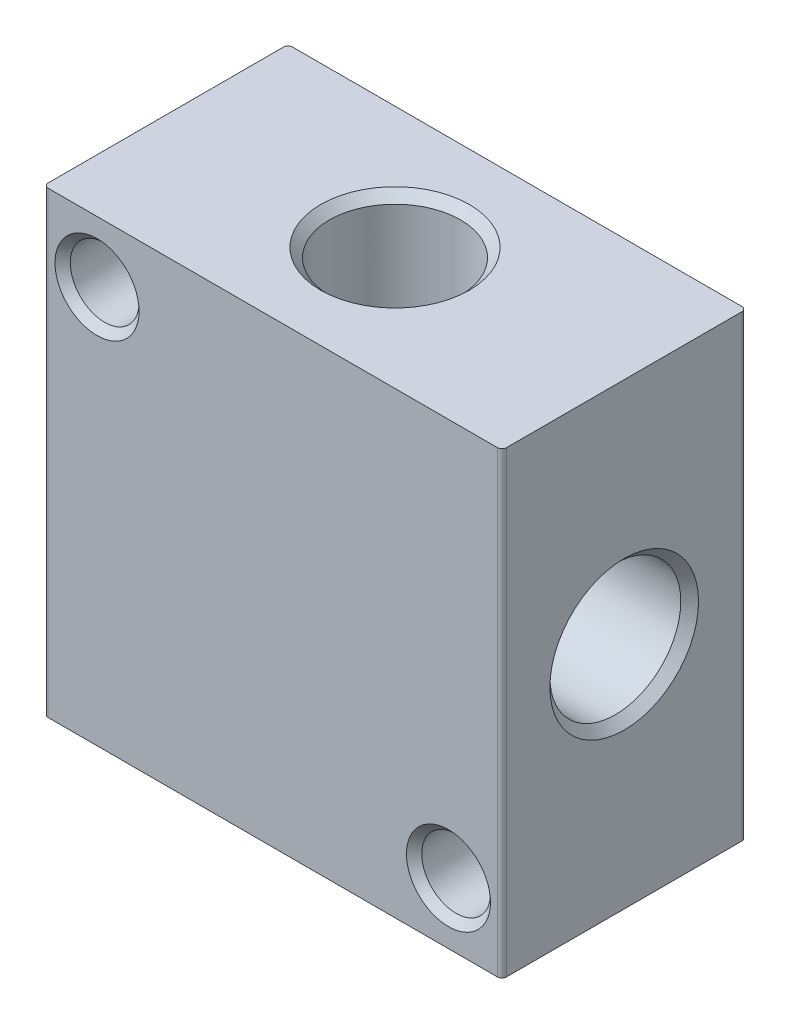
ISO-10303-21;
HEADER;
FILE_DESCRIPTION(('STEP AP214'),'2;1');
FILE_NAME('part.step','',(''),(''),'','','');
FILE_SCHEMA(('AUTOMOTIVE_DESIGN { 1 0 10303 214 1 1 1 1 }'));
ENDSEC;
DATA;
#1=APPLICATION_CONTEXT('core data for automotive mechanical design processes');
#2=APPLICATION_PROTOCOL_DEFINITION('international standard','automotive_design',2000,#1);
#3=PRODUCT_CONTEXT('',#1,'mechanical');
#4=PRODUCT('Part','Part','',(#3));
#5=PRODUCT_RELATED_PRODUCT_CATEGORY('part','',(#4));
#6=PRODUCT_DEFINITION_FORMATION('','',#4);
#7=PRODUCT_DEFINITION_CONTEXT('part definition',#1,'design');
#8=PRODUCT_DEFINITION('design','',#6,#7);
#9=PRODUCT_DEFINITION_SHAPE('','',#8);
#10=(LENGTH_UNIT() NAMED_UNIT(*) SI_UNIT(.MILLI.,.METRE.));
#11=(NAMED_UNIT(*) PLANE_ANGLE_UNIT() SI_UNIT($,.RADIAN.));
#12=(NAMED_UNIT(*) SI_UNIT($,.STERADIAN.) SOLID_ANGLE_UNIT());
#13=UNCERTAINTY_MEASURE_WITH_UNIT(LENGTH_MEASURE(1.E-05),#10,'distance_accuracy_value','');
#14=(GEOMETRIC_REPRESENTATION_CONTEXT(3) GLOBAL_UNCERTAINTY_ASSIGNED_CONTEXT((#13)) GLOBAL_UNIT_ASSIGNED_CONTEXT((#10,
#11,#12)) REPRESENTATION_CONTEXT('',''));
#15=CARTESIAN_POINT('',(0.,0.,0.));
#16=DIRECTION('',(0.,0.,1.));
#17=DIRECTION('',(1.,0.,0.));
#18=AXIS2_PLACEMENT_3D('',#15,#16,#17);
#19=CARTESIAN_POINT('',(-0.0865140894344868,0.,8.));
#20=DIRECTION('',(1.,0.,0.));
#21=DIRECTION('',(0.,0.,-1.));
#22=AXIS2_PLACEMENT_3D('',#19,#20,#21);
#23=CYLINDRICAL_SURFACE('',#22,4.283);
#24=CARTESIAN_POINT('',(14.4190149057486,0.,8.));
#25=DIRECTION('',(-1.,0.,0.));
#26=DIRECTION('',(0.,0.,-1.));
#27=AXIS2_PLACEMENT_3D('',#24,#25,#26);
#28=CIRCLE('',#27,4.28299999999923);
#29=CARTESIAN_POINT('',(14.4190149057486,0.,3.71700000000077));
#30=VERTEX_POINT('',#29);
#31=EDGE_CURVE('E95',#30,#30,#28,.T.);
#32=ORIENTED_EDGE('',*,*,#31,.F.);
#33=EDGE_LOOP('',(#32));
#34=FACE_BOUND('',#33,.T.);
#35=CARTESIAN_POINT('',(0.,0.,8.));
#36=DIRECTION('',(-0.707106781186547,-0.707106781186547,0.));
#37=DIRECTION('',(0.707106781186547,-0.707106781186547,0.));
#38=AXIS2_PLACEMENT_3D('',#35,#36,#37);
#39=ELLIPSE('',#38,6.05707668764397,4.283);
#40=CARTESIAN_POINT('',(0.,0.,12.283));
#41=VERTEX_POINT('',#40);
#42=CARTESIAN_POINT('',(0.,0.,3.717));
#43=VERTEX_POINT('',#42);
#44=EDGE_CURVE('E19',#41,#43,#39,.F.);
#45=ORIENTED_EDGE('',*,*,#44,.F.);
#46=CARTESIAN_POINT('',(0.,0.,8.));
#47=DIRECTION('',(0.707106781186547,-0.707106781186547,0.));
#48=DIRECTION('',(-0.707106781186547,-0.707106781186547,0.));
#49=AXIS2_PLACEMENT_3D('',#46,#47,#48);
#50=ELLIPSE('',#49,6.05707668764397,4.283);
#51=EDGE_CURVE('E84',#43,#41,#50,.T.);
#52=ORIENTED_EDGE('',*,*,#51,.F.);
#53=EDGE_LOOP('',(#45,#52));
#54=FACE_BOUND('',#53,.T.);
#55=ADVANCED_FACE('F16',(#34,#54),#23,.F.);
#56=CARTESIAN_POINT('',(-14.4190149057478,0.,8.));
#57=DIRECTION('',(1.,0.,0.));
#58=DIRECTION('',(0.,0.,-1.));
#59=AXIS2_PLACEMENT_3D('',#56,#57,#58);
#60=CYLINDRICAL_SURFACE('',#59,4.283);
#61=CARTESIAN_POINT('',(0.,0.,8.));
#62=DIRECTION('',(0.707106781186547,-0.707106781186547,0.));
#63=DIRECTION('',(-0.707106781186547,-0.707106781186547,0.));
#64=AXIS2_PLACEMENT_3D('',#61,#62,#63);
#65=ELLIPSE('',#64,6.05707668764397,4.283);
#66=EDGE_CURVE('E89',#43,#41,#65,.F.);
#67=ORIENTED_EDGE('',*,*,#66,.F.);
#68=CARTESIAN_POINT('',(0.,0.,8.));
#69=DIRECTION('',(-0.707106781186547,-0.707106781186547,0.));
#70=DIRECTION('',(0.707106781186547,-0.707106781186547,0.));
#71=AXIS2_PLACEMENT_3D('',#68,#69,#70);
#72=ELLIPSE('',#71,6.05707668764397,4.283);
#73=EDGE_CURVE('E99',#41,#43,#72,.T.);
#74=ORIENTED_EDGE('',*,*,#73,.F.);
#75=EDGE_LOOP('',(#67,#74));
#76=FACE_BOUND('',#75,.T.);
#77=CARTESIAN_POINT('',(-14.4190149057486,0.,8.));
#78=DIRECTION('',(1.,0.,0.));
#79=DIRECTION('',(0.,0.,-1.));
#80=AXIS2_PLACEMENT_3D('',#77,#78,#79);
#81=CIRCLE('',#80,4.28299999999924);
#82=CARTESIAN_POINT('',(-14.4190149057486,0.,3.71700000000076));
#83=VERTEX_POINT('',#82);
#84=EDGE_CURVE('E100',#83,#83,#81,.T.);
#85=ORIENTED_EDGE('',*,*,#84,.F.);
#86=EDGE_LOOP('',(#85));
#87=FACE_BOUND('',#86,.T.);
#88=ADVANCED_FACE('F102',(#76,#87),#60,.F.);
#89=CARTESIAN_POINT('',(0.,0.0865140894344868,8.));
#90=DIRECTION('',(0.,-1.,0.));
#91=DIRECTION('',(0.,0.,-1.));
#92=AXIS2_PLACEMENT_3D('',#89,#90,#91);
#93=CYLINDRICAL_SURFACE('',#92,4.283);
#94=ORIENTED_EDGE('',*,*,#66,.T.);
#95=ORIENTED_EDGE('',*,*,#44,.T.);
#96=EDGE_LOOP('',(#94,#95));
#97=FACE_BOUND('',#96,.T.);
#98=CARTESIAN_POINT('',(0.,-14.4190149057486,8.));
#99=DIRECTION('',(0.,1.,0.));
#100=DIRECTION('',(0.,0.,-1.));
#101=AXIS2_PLACEMENT_3D('',#98,#99,#100);
#102=CIRCLE('',#101,4.28299999999924);
#103=CARTESIAN_POINT('',(0.,-14.4190149057486,3.71700000000076));
#104=VERTEX_POINT('',#103);
#105=EDGE_CURVE('E114',#104,#104,#102,.T.);
#106=ORIENTED_EDGE('',*,*,#105,.F.);
#107=EDGE_LOOP('',(#106));
#108=FACE_BOUND('',#107,.T.);
#109=ADVANCED_FACE('F91',(#97,#108),#93,.F.);
#110=CARTESIAN_POINT('',(14.9999999999993,0.,8.));
#111=DIRECTION('',(1.,0.,0.));
#112=DIRECTION('',(0.,0.,-1.));
#113=AXIS2_PLACEMENT_3D('',#110,#111,#112);
#114=CONICAL_SURFACE('',#113,4.86398307230816,0.785396423296609);
#115=ORIENTED_EDGE('',*,*,#31,.T.);
#116=EDGE_LOOP('',(#115));
#117=FACE_BOUND('',#116,.T.);
#118=CARTESIAN_POINT('',(14.9999999999993,0.,8.));
#119=DIRECTION('',(1.,0.,0.));
#120=DIRECTION('',(0.,0.,-1.));
#121=AXIS2_PLACEMENT_3D('',#118,#119,#120);
#122=CIRCLE('',#121,4.86398307230816);
#123=CARTESIAN_POINT('',(14.9999999999993,0.,3.13601692769184));
#124=VERTEX_POINT('',#123);
#125=EDGE_CURVE('E115',#124,#124,#122,.F.);
#126=ORIENTED_EDGE('',*,*,#125,.F.);
#127=EDGE_LOOP('',(#126));
#128=FACE_BOUND('',#127,.T.);
#129=ADVANCED_FACE('F292',(#117,#128),#114,.F.);
#130=CARTESIAN_POINT('',(-14.9999999999993,0.,8.));
#131=DIRECTION('',(-1.,0.,0.));
#132=DIRECTION('',(0.,0.,1.));
#133=AXIS2_PLACEMENT_3D('',#130,#131,#132);
#134=CONICAL_SURFACE('',#133,4.86398307230816,0.785396423296609);
#135=CARTESIAN_POINT('',(-14.9999999999993,0.,8.));
#136=DIRECTION('',(-1.,0.,0.));
#137=DIRECTION('',(0.,0.,1.));
#138=AXIS2_PLACEMENT_3D('',#135,#136,#137);
#139=CIRCLE('',#138,4.86398307230816);
#140=CARTESIAN_POINT('',(-14.9999999999993,0.,12.8639830723082));
#141=VERTEX_POINT('',#140);
#142=EDGE_CURVE('E120',#141,#141,#139,.F.);
#143=ORIENTED_EDGE('',*,*,#142,.F.);
#144=EDGE_LOOP('',(#143));
#145=FACE_BOUND('',#144,.T.);
#146=ORIENTED_EDGE('',*,*,#84,.T.);
#147=EDGE_LOOP('',(#146));
#148=FACE_BOUND('',#147,.T.);
#149=ADVANCED_FACE('F286',(#145,#148),#134,.F.);
#150=CARTESIAN_POINT('',(0.,14.4190149057478,8.));
#151=DIRECTION('',(0.,-1.,0.));
#152=DIRECTION('',(0.,0.,-1.));
#153=AXIS2_PLACEMENT_3D('',#150,#151,#152);
#154=CYLINDRICAL_SURFACE('',#153,4.283);
#155=ORIENTED_EDGE('',*,*,#73,.T.);
#156=ORIENTED_EDGE('',*,*,#51,.T.);
#157=EDGE_LOOP('',(#155,#156));
#158=FACE_BOUND('',#157,.T.);
#159=CARTESIAN_POINT('',(0.,14.4190149057486,8.));
#160=DIRECTION('',(0.,-1.,0.));
#161=DIRECTION('',(0.,0.,-1.));
#162=AXIS2_PLACEMENT_3D('',#159,#160,#161);
#163=CIRCLE('',#162,4.28299999999924);
#164=CARTESIAN_POINT('',(0.,14.4190149057486,3.71700000000076));
#165=VERTEX_POINT('',#164);
#166=EDGE_CURVE('E123',#165,#165,#163,.T.);
#167=ORIENTED_EDGE('',*,*,#166,.F.);
#168=EDGE_LOOP('',(#167));
#169=FACE_BOUND('',#168,.T.);
#170=ADVANCED_FACE('F97',(#158,#169),#154,.F.);
#171=CARTESIAN_POINT('',(-14.7,15.,15.7));
#172=DIRECTION('',(0.,1.,0.));
#173=DIRECTION('',(-1.,0.,0.));
#174=AXIS2_PLACEMENT_3D('',#171,#172,#173);
#175=CYLINDRICAL_SURFACE('',#174,0.300000000000002);
#176=CARTESIAN_POINT('',(-14.7,15.,15.7));
#177=DIRECTION('',(0.,1.,0.));
#178=DIRECTION('',(-1.,0.,0.));
#179=AXIS2_PLACEMENT_3D('',#176,#177,#178);
#180=CIRCLE('',#179,0.300000000000002);
#181=CARTESIAN_POINT('',(-14.7,15.,16.));
#182=VERTEX_POINT('',#181);
#183=CARTESIAN_POINT('',(-15.,15.,15.7));
#184=VERTEX_POINT('',#183);
#185=EDGE_CURVE('E106',#182,#184,#180,.F.);
#186=ORIENTED_EDGE('',*,*,#185,.T.);
#187=DIRECTION('',(0.,1.,0.));
#188=VECTOR('',#187,1.);
#189=CARTESIAN_POINT('',(-15.,-15.,15.7));
#190=LINE('',#189,#188);
#191=CARTESIAN_POINT('',(-15.,-15.,15.7));
#192=VERTEX_POINT('',#191);
#193=EDGE_CURVE('E118',#192,#184,#190,.T.);
#194=ORIENTED_EDGE('',*,*,#193,.F.);
#195=CARTESIAN_POINT('',(-14.7000000000001,-15.,15.7));
#196=DIRECTION('',(0.,1.,0.));
#197=DIRECTION('',(-1.,0.,0.));
#198=AXIS2_PLACEMENT_3D('',#195,#196,#197);
#199=CIRCLE('',#198,0.300000000000002);
#200=CARTESIAN_POINT('',(-14.7,-15.,16.));
#201=VERTEX_POINT('',#200);
#202=EDGE_CURVE('E104',#192,#201,#199,.T.);
#203=ORIENTED_EDGE('',*,*,#202,.T.);
#204=DIRECTION('',(0.,1.,0.));
#205=VECTOR('',#204,1.);
#206=CARTESIAN_POINT('',(-14.7,-15.,16.));
#207=LINE('',#206,#205);
#208=EDGE_CURVE('E167',#182,#201,#207,.F.);
#209=ORIENTED_EDGE('',*,*,#208,.F.);
#210=EDGE_LOOP('',(#186,#194,#203,#209));
#211=FACE_BOUND('',#210,.T.);
#212=ADVANCED_FACE('F277',(#211),#175,.T.);
#213=CARTESIAN_POINT('',(14.7,-15.,15.7));
#214=DIRECTION('',(0.,-1.,0.));
#215=DIRECTION('',(1.,0.,0.));
#216=AXIS2_PLACEMENT_3D('',#213,#214,#215);
#217=CYLINDRICAL_SURFACE('',#216,0.300000000000002);
#218=CARTESIAN_POINT('',(14.7,-15.,15.7));
#219=DIRECTION('',(0.,-1.,0.));
#220=DIRECTION('',(1.,0.,0.));
#221=AXIS2_PLACEMENT_3D('',#218,#219,#220);
#222=CIRCLE('',#221,0.300000000000002);
#223=CARTESIAN_POINT('',(14.7,-15.,16.));
#224=VERTEX_POINT('',#223);
#225=CARTESIAN_POINT('',(15.,-15.,15.7));
#226=VERTEX_POINT('',#225);
#227=EDGE_CURVE('E112',#224,#226,#222,.F.);
#228=ORIENTED_EDGE('',*,*,#227,.T.);
#229=DIRECTION('',(0.,-1.,0.));
#230=VECTOR('',#229,1.);
#231=CARTESIAN_POINT('',(15.,0.,15.7));
#232=LINE('',#231,#230);
#233=CARTESIAN_POINT('',(15.,15.,15.7));
#234=VERTEX_POINT('',#233);
#235=EDGE_CURVE('E119',#234,#226,#232,.T.);
#236=ORIENTED_EDGE('',*,*,#235,.F.);
#237=CARTESIAN_POINT('',(14.7000000000001,15.,15.7));
#238=DIRECTION('',(0.,-1.,0.));
#239=DIRECTION('',(1.,0.,0.));
#240=AXIS2_PLACEMENT_3D('',#237,#238,#239);
#241=CIRCLE('',#240,0.300000000000002);
#242=CARTESIAN_POINT('',(14.7,15.,16.));
#243=VERTEX_POINT('',#242);
#244=EDGE_CURVE('E110',#234,#243,#241,.T.);
#245=ORIENTED_EDGE('',*,*,#244,.T.);
#246=DIRECTION('',(0.,1.,0.));
#247=VECTOR('',#246,1.);
#248=CARTESIAN_POINT('',(14.7,-15.,16.));
#249=LINE('',#248,#247);
#250=EDGE_CURVE('E128',#224,#243,#249,.T.);
#251=ORIENTED_EDGE('',*,*,#250,.F.);
#252=EDGE_LOOP('',(#228,#236,#245,#251));
#253=FACE_BOUND('',#252,.T.);
#254=ADVANCED_FACE('F270',(#253),#217,.T.);
#255=CARTESIAN_POINT('',(11.5,-11.,15.9999999999994));
#256=DIRECTION('',(0.,0.,1.));
#257=DIRECTION('',(1.,0.,0.));
#258=AXIS2_PLACEMENT_3D('',#255,#256,#257);
#259=CONICAL_SURFACE('',#258,2.74995878038691,0.785390668869455);
#260=CARTESIAN_POINT('',(11.5,-11.,15.9999999999994));
#261=DIRECTION('',(0.,0.,1.));
#262=DIRECTION('',(1.,0.,0.));
#263=AXIS2_PLACEMENT_3D('',#260,#261,#262);
#264=CIRCLE('',#263,2.74995878038691);
#265=CARTESIAN_POINT('',(14.2499587803869,-11.,15.9999999999994));
#266=VERTEX_POINT('',#265);
#267=EDGE_CURVE('E124',#266,#266,#264,.F.);
#268=ORIENTED_EDGE('',*,*,#267,.F.);
#269=EDGE_LOOP('',(#268));
#270=FACE_BOUND('',#269,.T.);
#271=CARTESIAN_POINT('',(11.5,-11.,15.5000337256449));
#272=DIRECTION('',(0.,0.,-1.));
#273=DIRECTION('',(1.,0.,0.));
#274=AXIS2_PLACEMENT_3D('',#271,#272,#273);
#275=CIRCLE('',#274,2.25);
#276=CARTESIAN_POINT('',(13.75,-11.,15.5000337256449));
#277=VERTEX_POINT('',#276);
#278=EDGE_CURVE('E170',#277,#277,#275,.F.);
#279=ORIENTED_EDGE('',*,*,#278,.F.);
#280=EDGE_LOOP('',(#279));
#281=FACE_BOUND('',#280,.T.);
#282=ADVANCED_FACE('F284',(#270,#281),#259,.F.);
#283=CARTESIAN_POINT('',(0.,-14.9999999999993,8.));
#284=DIRECTION('',(0.,-1.,0.));
#285=DIRECTION('',(0.,0.,-1.));
#286=AXIS2_PLACEMENT_3D('',#283,#284,#285);
#287=CONICAL_SURFACE('',#286,4.86398307230816,0.785396423296609);
#288=CARTESIAN_POINT('',(0.,-14.9999999999993,8.));
#289=DIRECTION('',(0.,-1.,0.));
#290=DIRECTION('',(0.,0.,-1.));
#291=AXIS2_PLACEMENT_3D('',#288,#289,#290);
#292=CIRCLE('',#291,4.86398307230816);
#293=CARTESIAN_POINT('',(0.,-14.9999999999993,3.13601692769184));
#294=VERTEX_POINT('',#293);
#295=EDGE_CURVE('E134',#294,#294,#292,.F.);
#296=ORIENTED_EDGE('',*,*,#295,.F.);
#297=EDGE_LOOP('',(#296));
#298=FACE_BOUND('',#297,.T.);
#299=ORIENTED_EDGE('',*,*,#105,.T.);
#300=EDGE_LOOP('',(#299));
#301=FACE_BOUND('',#300,.T.);
#302=ADVANCED_FACE('F310',(#298,#301),#287,.F.);
#303=CARTESIAN_POINT('',(15.,-15.,0.3));
#304=DIRECTION('',(1.,0.,0.));
#305=DIRECTION('',(0.,1.,0.));
#306=AXIS2_PLACEMENT_3D('',#303,#304,#305);
#307=PLANE('',#306);
#308=ORIENTED_EDGE('',*,*,#125,.T.);
#309=EDGE_LOOP('',(#308));
#310=FACE_BOUND('',#309,.T.);
#311=DIRECTION('',(0.,-1.,0.));
#312=VECTOR('',#311,1.);
#313=CARTESIAN_POINT('',(15.,0.,0.3));
#314=LINE('',#313,#312);
#315=CARTESIAN_POINT('',(15.,15.,0.3));
#316=VERTEX_POINT('',#315);
#317=CARTESIAN_POINT('',(15.,-15.,0.3));
#318=VERTEX_POINT('',#317);
#319=EDGE_CURVE('E127',#316,#318,#314,.T.);
#320=ORIENTED_EDGE('',*,*,#319,.F.);
#321=DIRECTION('',(0.,0.,-1.));
#322=VECTOR('',#321,1.);
#323=CARTESIAN_POINT('',(15.,15.,16.));
#324=LINE('',#323,#322);
#325=EDGE_CURVE('E145',#234,#316,#324,.T.);
#326=ORIENTED_EDGE('',*,*,#325,.F.);
#327=ORIENTED_EDGE('',*,*,#235,.T.);
#328=DIRECTION('',(0.,0.,1.));
#329=VECTOR('',#328,1.);
#330=CARTESIAN_POINT('',(15.,-15.,8.));
#331=LINE('',#330,#329);
#332=EDGE_CURVE('E132',#318,#226,#331,.T.);
#333=ORIENTED_EDGE('',*,*,#332,.F.);
#334=EDGE_LOOP('',(#320,#326,#327,#333));
#335=FACE_BOUND('',#334,.T.);
#336=ADVANCED_FACE('F267',(#310,#335),#307,.T.);
#337=CARTESIAN_POINT('',(-15.,-15.,0.3));
#338=DIRECTION('',(-1.,0.,0.));
#339=DIRECTION('',(0.,0.,1.));
#340=AXIS2_PLACEMENT_3D('',#337,#338,#339);
#341=PLANE('',#340);
#342=ORIENTED_EDGE('',*,*,#142,.T.);
#343=EDGE_LOOP('',(#342));
#344=FACE_BOUND('',#343,.T.);
#345=DIRECTION('',(0.,1.,0.));
#346=VECTOR('',#345,1.);
#347=CARTESIAN_POINT('',(-15.,0.,0.3));
#348=LINE('',#347,#346);
#349=CARTESIAN_POINT('',(-15.,-15.,0.3));
#350=VERTEX_POINT('',#349);
#351=CARTESIAN_POINT('',(-15.,15.,0.3));
#352=VERTEX_POINT('',#351);
#353=EDGE_CURVE('E141',#350,#352,#348,.T.);
#354=ORIENTED_EDGE('',*,*,#353,.F.);
#355=DIRECTION('',(0.,0.,-1.));
#356=VECTOR('',#355,1.);
#357=CARTESIAN_POINT('',(-15.,-15.,8.));
#358=LINE('',#357,#356);
#359=EDGE_CURVE('E133',#192,#350,#358,.T.);
#360=ORIENTED_EDGE('',*,*,#359,.F.);
#361=ORIENTED_EDGE('',*,*,#193,.T.);
#362=DIRECTION('',(0.,0.,-1.));
#363=VECTOR('',#362,1.);
#364=CARTESIAN_POINT('',(-15.,15.,16.));
#365=LINE('',#364,#363);
#366=EDGE_CURVE('E147',#352,#184,#365,.F.);
#367=ORIENTED_EDGE('',*,*,#366,.F.);
#368=EDGE_LOOP('',(#354,#360,#361,#367));
#369=FACE_BOUND('',#368,.T.);
#370=ADVANCED_FACE('F258',(#344,#369),#341,.T.);
#371=CARTESIAN_POINT('',(0.,14.9999999999993,8.));
#372=DIRECTION('',(0.,1.,0.));
#373=DIRECTION('',(0.,0.,1.));
#374=AXIS2_PLACEMENT_3D('',#371,#372,#373);
#375=CONICAL_SURFACE('',#374,4.86398307230816,0.785396423296609);
#376=ORIENTED_EDGE('',*,*,#166,.T.);
#377=EDGE_LOOP('',(#376));
#378=FACE_BOUND('',#377,.T.);
#379=CARTESIAN_POINT('',(0.,14.9999999999993,8.));
#380=DIRECTION('',(0.,1.,0.));
#381=DIRECTION('',(0.,0.,1.));
#382=AXIS2_PLACEMENT_3D('',#379,#380,#381);
#383=CIRCLE('',#382,4.86398307230816);
#384=CARTESIAN_POINT('',(0.,14.9999999999993,12.8639830723082));
#385=VERTEX_POINT('',#384);
#386=EDGE_CURVE('E148',#385,#385,#383,.F.);
#387=ORIENTED_EDGE('',*,*,#386,.F.);
#388=EDGE_LOOP('',(#387));
#389=FACE_BOUND('',#388,.T.);
#390=ADVANCED_FACE('F316',(#378,#389),#375,.F.);
#391=CARTESIAN_POINT('',(11.5,-11.,15.5000337256449));
#392=DIRECTION('',(0.,0.,-1.));
#393=DIRECTION('',(-1.,0.,0.));
#394=AXIS2_PLACEMENT_3D('',#391,#392,#393);
#395=CYLINDRICAL_SURFACE('',#394,2.25);
#396=CARTESIAN_POINT('',(11.5,-11.,0.49996627435901));
#397=DIRECTION('',(0.,0.,1.));
#398=DIRECTION('',(0.,-1.,0.));
#399=AXIS2_PLACEMENT_3D('',#396,#397,#398);
#400=CIRCLE('',#399,2.24999999999936);
#401=CARTESIAN_POINT('',(11.5,-13.2499999999994,0.49996627435901));
#402=VERTEX_POINT('',#401);
#403=EDGE_CURVE('E151',#402,#402,#400,.T.);
#404=ORIENTED_EDGE('',*,*,#403,.F.);
#405=EDGE_LOOP('',(#404));
#406=FACE_BOUND('',#405,.T.);
#407=ORIENTED_EDGE('',*,*,#278,.T.);
#408=EDGE_LOOP('',(#407));
#409=FACE_BOUND('',#408,.T.);
#410=ADVANCED_FACE('F330',(#406,#409),#395,.F.);
#411=CARTESIAN_POINT('',(-14.7,-15.,16.));
#412=DIRECTION('',(0.,0.,1.));
#413=DIRECTION('',(1.,0.,0.));
#414=AXIS2_PLACEMENT_3D('',#411,#412,#413);
#415=PLANE('',#414);
#416=CARTESIAN_POINT('',(-11.5,11.,15.9999999999994));
#417=DIRECTION('',(0.,0.,1.));
#418=DIRECTION('',(1.,0.,0.));
#419=AXIS2_PLACEMENT_3D('',#416,#417,#418);
#420=CIRCLE('',#419,2.74995878038691);
#421=CARTESIAN_POINT('',(-8.75004121961309,11.,15.9999999999994));
#422=VERTEX_POINT('',#421);
#423=EDGE_CURVE('E152',#422,#422,#420,.T.);
#424=ORIENTED_EDGE('',*,*,#423,.F.);
#425=EDGE_LOOP('',(#424));
#426=FACE_BOUND('',#425,.T.);
#427=ORIENTED_EDGE('',*,*,#267,.T.);
#428=EDGE_LOOP('',(#427));
#429=FACE_BOUND('',#428,.T.);
#430=ORIENTED_EDGE('',*,*,#250,.T.);
#431=DIRECTION('',(1.,0.,0.));
#432=VECTOR('',#431,1.);
#433=CARTESIAN_POINT('',(0.,15.,16.));
#434=LINE('',#433,#432);
#435=EDGE_CURVE('E171',#182,#243,#434,.T.);
#436=ORIENTED_EDGE('',*,*,#435,.F.);
#437=ORIENTED_EDGE('',*,*,#208,.T.);
#438=DIRECTION('',(1.,0.,0.));
#439=VECTOR('',#438,1.);
#440=CARTESIAN_POINT('',(-15.,-15.,16.));
#441=LINE('',#440,#439);
#442=EDGE_CURVE('E138',#224,#201,#441,.F.);
#443=ORIENTED_EDGE('',*,*,#442,.F.);
#444=EDGE_LOOP('',(#430,#436,#437,#443));
#445=FACE_BOUND('',#444,.T.);
#446=ADVANCED_FACE('F274',(#426,#429,#445),#415,.T.);
#447=CARTESIAN_POINT('',(14.7,15.,0.3));
#448=DIRECTION('',(0.,1.,0.));
#449=DIRECTION('',(-1.,0.,0.));
#450=AXIS2_PLACEMENT_3D('',#447,#448,#449);
#451=CYLINDRICAL_SURFACE('',#450,0.3);
#452=CARTESIAN_POINT('',(14.7,15.,0.3));
#453=DIRECTION('',(0.,1.,0.));
#454=DIRECTION('',(-1.,0.,0.));
#455=AXIS2_PLACEMENT_3D('',#452,#453,#454);
#456=CIRCLE('',#455,0.3);
#457=CARTESIAN_POINT('',(14.7,15.,0.));
#458=VERTEX_POINT('',#457);
#459=EDGE_CURVE('E142',#316,#458,#456,.T.);
#460=ORIENTED_EDGE('',*,*,#459,.F.);
#461=ORIENTED_EDGE('',*,*,#319,.T.);
#462=CARTESIAN_POINT('',(14.7000000000001,-15.,0.3));
#463=DIRECTION('',(0.,1.,0.));
#464=DIRECTION('',(-1.,0.,0.));
#465=AXIS2_PLACEMENT_3D('',#462,#463,#464);
#466=CIRCLE('',#465,0.3);
#467=CARTESIAN_POINT('',(14.7,-15.,0.));
#468=VERTEX_POINT('',#467);
#469=EDGE_CURVE('E129',#468,#318,#466,.F.);
#470=ORIENTED_EDGE('',*,*,#469,.F.);
#471=DIRECTION('',(0.,1.,0.));
#472=VECTOR('',#471,1.);
#473=CARTESIAN_POINT('',(14.7,-15.,0.));
#474=LINE('',#473,#472);
#475=EDGE_CURVE('E155',#458,#468,#474,.F.);
#476=ORIENTED_EDGE('',*,*,#475,.F.);
#477=EDGE_LOOP('',(#460,#461,#470,#476));
#478=FACE_BOUND('',#477,.T.);
#479=ADVANCED_FACE('F263',(#478),#451,.T.);
#480=CARTESIAN_POINT('',(-15.,-15.,16.));
#481=DIRECTION('',(0.,-1.,0.));
#482=DIRECTION('',(0.,0.,-1.));
#483=AXIS2_PLACEMENT_3D('',#480,#481,#482);
#484=PLANE('',#483);
#485=ORIENTED_EDGE('',*,*,#295,.T.);
#486=EDGE_LOOP('',(#485));
#487=FACE_BOUND('',#486,.T.);
#488=ORIENTED_EDGE('',*,*,#227,.F.);
#489=ORIENTED_EDGE('',*,*,#442,.T.);
#490=ORIENTED_EDGE('',*,*,#202,.F.);
#491=ORIENTED_EDGE('',*,*,#359,.T.);
#492=CARTESIAN_POINT('',(-14.7,-15.,0.3));
#493=DIRECTION('',(0.,-1.,0.));
#494=DIRECTION('',(1.,0.,0.));
#495=AXIS2_PLACEMENT_3D('',#492,#493,#494);
#496=CIRCLE('',#495,0.3);
#497=CARTESIAN_POINT('',(-14.7,-15.,0.));
#498=VERTEX_POINT('',#497);
#499=EDGE_CURVE('E137',#498,#350,#496,.F.);
#500=ORIENTED_EDGE('',*,*,#499,.F.);
#501=DIRECTION('',(-1.,0.,0.));
#502=VECTOR('',#501,1.);
#503=CARTESIAN_POINT('',(0.,-15.,0.));
#504=LINE('',#503,#502);
#505=EDGE_CURVE('E189',#468,#498,#504,.T.);
#506=ORIENTED_EDGE('',*,*,#505,.F.);
#507=ORIENTED_EDGE('',*,*,#469,.T.);
#508=ORIENTED_EDGE('',*,*,#332,.T.);
#509=EDGE_LOOP('',(#488,#489,#490,#491,#500,#506,#507,#508));
#510=FACE_BOUND('',#509,.T.);
#511=ADVANCED_FACE('F254',(#487,#510),#484,.T.);
#512=CARTESIAN_POINT('',(-14.7,-15.,0.3));
#513=DIRECTION('',(0.,-1.,0.));
#514=DIRECTION('',(1.,0.,0.));
#515=AXIS2_PLACEMENT_3D('',#512,#513,#514);
#516=CYLINDRICAL_SURFACE('',#515,0.3);
#517=ORIENTED_EDGE('',*,*,#499,.T.);
#518=ORIENTED_EDGE('',*,*,#353,.T.);
#519=CARTESIAN_POINT('',(-14.7000000000001,15.,0.3));
#520=DIRECTION('',(0.,-1.,0.));
#521=DIRECTION('',(1.,0.,0.));
#522=AXIS2_PLACEMENT_3D('',#519,#520,#521);
#523=CIRCLE('',#522,0.3);
#524=CARTESIAN_POINT('',(-14.7,15.,0.));
#525=VERTEX_POINT('',#524);
#526=EDGE_CURVE('E34',#525,#352,#523,.F.);
#527=ORIENTED_EDGE('',*,*,#526,.F.);
#528=DIRECTION('',(0.,1.,0.));
#529=VECTOR('',#528,1.);
#530=CARTESIAN_POINT('',(-14.7,-15.,0.));
#531=LINE('',#530,#529);
#532=EDGE_CURVE('E192',#498,#525,#531,.T.);
#533=ORIENTED_EDGE('',*,*,#532,.F.);
#534=EDGE_LOOP('',(#517,#518,#527,#533));
#535=FACE_BOUND('',#534,.T.);
#536=ADVANCED_FACE('F250',(#535),#516,.T.);
#537=CARTESIAN_POINT('',(-15.,15.,16.));
#538=DIRECTION('',(0.,1.,0.));
#539=DIRECTION('',(1.,0.,0.));
#540=AXIS2_PLACEMENT_3D('',#537,#538,#539);
#541=PLANE('',#540);
#542=ORIENTED_EDGE('',*,*,#386,.T.);
#543=EDGE_LOOP('',(#542));
#544=FACE_BOUND('',#543,.T.);
#545=ORIENTED_EDGE('',*,*,#526,.T.);
#546=ORIENTED_EDGE('',*,*,#366,.T.);
#547=ORIENTED_EDGE('',*,*,#185,.F.);
#548=ORIENTED_EDGE('',*,*,#435,.T.);
#549=ORIENTED_EDGE('',*,*,#244,.F.);
#550=ORIENTED_EDGE('',*,*,#325,.T.);
#551=ORIENTED_EDGE('',*,*,#459,.T.);
#552=DIRECTION('',(1.,0.,0.));
#553=VECTOR('',#552,1.);
#554=CARTESIAN_POINT('',(0.,15.,0.));
#555=LINE('',#554,#553);
#556=EDGE_CURVE('E160',#525,#458,#555,.T.);
#557=ORIENTED_EDGE('',*,*,#556,.F.);
#558=EDGE_LOOP('',(#545,#546,#547,#548,#549,#550,#551,#557));
#559=FACE_BOUND('',#558,.T.);
#560=ADVANCED_FACE('F231',(#544,#559),#541,.T.);
#561=CARTESIAN_POINT('',(11.5,-11.,6.4E-13));
#562=DIRECTION('',(0.,0.,-1.));
#563=DIRECTION('',(-1.,0.,0.));
#564=AXIS2_PLACEMENT_3D('',#561,#562,#563);
#565=CONICAL_SURFACE('',#564,2.74995878039141,0.785390668869443);
#566=CARTESIAN_POINT('',(11.5,-11.,6.4E-13));
#567=DIRECTION('',(0.,0.,-1.));
#568=DIRECTION('',(-1.,0.,0.));
#569=AXIS2_PLACEMENT_3D('',#566,#567,#568);
#570=CIRCLE('',#569,2.74995878039141);
#571=CARTESIAN_POINT('',(8.75004121960859,-11.,6.4E-13));
#572=VERTEX_POINT('',#571);
#573=EDGE_CURVE('E156',#572,#572,#570,.F.);
#574=ORIENTED_EDGE('',*,*,#573,.F.);
#575=EDGE_LOOP('',(#574));
#576=FACE_BOUND('',#575,.T.);
#577=ORIENTED_EDGE('',*,*,#403,.T.);
#578=EDGE_LOOP('',(#577));
#579=FACE_BOUND('',#578,.T.);
#580=ADVANCED_FACE('F221',(#576,#579),#565,.F.);
#581=CARTESIAN_POINT('',(-11.5,11.,15.9999999999994));
#582=DIRECTION('',(0.,0.,1.));
#583=DIRECTION('',(1.,0.,0.));
#584=AXIS2_PLACEMENT_3D('',#581,#582,#583);
#585=CONICAL_SURFACE('',#584,2.74995878038691,0.785390668869455);
#586=ORIENTED_EDGE('',*,*,#423,.T.);
#587=EDGE_LOOP('',(#586));
#588=FACE_BOUND('',#587,.T.);
#589=CARTESIAN_POINT('',(-11.5,11.,15.5000337256449));
#590=DIRECTION('',(0.,0.,-1.));
#591=DIRECTION('',(1.,0.,0.));
#592=AXIS2_PLACEMENT_3D('',#589,#590,#591);
#593=CIRCLE('',#592,2.25);
#594=CARTESIAN_POINT('',(-9.25,11.,15.5000337256449));
#595=VERTEX_POINT('',#594);
#596=EDGE_CURVE('E159',#595,#595,#593,.F.);
#597=ORIENTED_EDGE('',*,*,#596,.F.);
#598=EDGE_LOOP('',(#597));
#599=FACE_BOUND('',#598,.T.);
#600=ADVANCED_FACE('F218',(#588,#599),#585,.F.);
#601=CARTESIAN_POINT('',(14.7,-15.,0.));
#602=DIRECTION('',(0.,0.,-1.));
#603=DIRECTION('',(-1.,0.,0.));
#604=AXIS2_PLACEMENT_3D('',#601,#602,#603);
#605=PLANE('',#604);
#606=CARTESIAN_POINT('',(-11.5,11.,6.40004542418193E-13));
#607=DIRECTION('',(0.,0.,-1.));
#608=DIRECTION('',(-1.,0.,0.));
#609=AXIS2_PLACEMENT_3D('',#606,#607,#608);
#610=CIRCLE('',#609,2.74995878039141);
#611=CARTESIAN_POINT('',(-14.2499587803914,11.,6.40004542418193E-13));
#612=VERTEX_POINT('',#611);
#613=EDGE_CURVE('E25',#612,#612,#610,.T.);
#614=ORIENTED_EDGE('',*,*,#613,.F.);
#615=EDGE_LOOP('',(#614));
#616=FACE_BOUND('',#615,.T.);
#617=ORIENTED_EDGE('',*,*,#573,.T.);
#618=EDGE_LOOP('',(#617));
#619=FACE_BOUND('',#618,.T.);
#620=ORIENTED_EDGE('',*,*,#532,.T.);
#621=ORIENTED_EDGE('',*,*,#556,.T.);
#622=ORIENTED_EDGE('',*,*,#475,.T.);
#623=ORIENTED_EDGE('',*,*,#505,.T.);
#624=EDGE_LOOP('',(#620,#621,#622,#623));
#625=FACE_BOUND('',#624,.T.);
#626=ADVANCED_FACE('F220',(#616,#619,#625),#605,.T.);
#627=CARTESIAN_POINT('',(-11.5,11.,15.5000337256449));
#628=DIRECTION('',(0.,0.,-1.));
#629=DIRECTION('',(-1.,0.,0.));
#630=AXIS2_PLACEMENT_3D('',#627,#628,#629);
#631=CYLINDRICAL_SURFACE('',#630,2.25);
#632=CARTESIAN_POINT('',(-11.5,11.,0.49996627435901));
#633=DIRECTION('',(0.,0.,1.));
#634=DIRECTION('',(0.,-1.,0.));
#635=AXIS2_PLACEMENT_3D('',#632,#633,#634);
#636=CIRCLE('',#635,2.24999999999936);
#637=CARTESIAN_POINT('',(-11.5,8.75000000000064,0.49996627435901));
#638=VERTEX_POINT('',#637);
#639=EDGE_CURVE('E11',#638,#638,#636,.T.);
#640=ORIENTED_EDGE('',*,*,#639,.F.);
#641=EDGE_LOOP('',(#640));
#642=FACE_BOUND('',#641,.T.);
#643=ORIENTED_EDGE('',*,*,#596,.T.);
#644=EDGE_LOOP('',(#643));
#645=FACE_BOUND('',#644,.T.);
#646=ADVANCED_FACE('F216',(#642,#645),#631,.F.);
#647=CARTESIAN_POINT('',(-11.5,11.,6.4E-13));
#648=DIRECTION('',(0.,0.,-1.));
#649=DIRECTION('',(-1.,0.,0.));
#650=AXIS2_PLACEMENT_3D('',#647,#648,#649);
#651=CONICAL_SURFACE('',#650,2.74995878039141,0.785390668869447);
#652=ORIENTED_EDGE('',*,*,#639,.T.);
#653=EDGE_LOOP('',(#652));
#654=FACE_BOUND('',#653,.T.);
#655=ORIENTED_EDGE('',*,*,#613,.T.);
#656=EDGE_LOOP('',(#655));
#657=FACE_BOUND('',#656,.T.);
#658=ADVANCED_FACE('F234',(#654,#657),#651,.F.);
#659=CLOSED_SHELL('',(#55,#88,#109,#129,#149,#170,#212,#254,#282,#302,#336,#370,#390,#410,#446,
#479,#511,#536,#560,#580,#600,#626,#646,#658));
#660=MANIFOLD_SOLID_BREP('B1',#659);
#661=ADVANCED_BREP_SHAPE_REPRESENTATION('',(#18,#660),#14);
#662=SHAPE_DEFINITION_REPRESENTATION(#9,#661);
ENDSEC;
END-ISO-10303-21;
